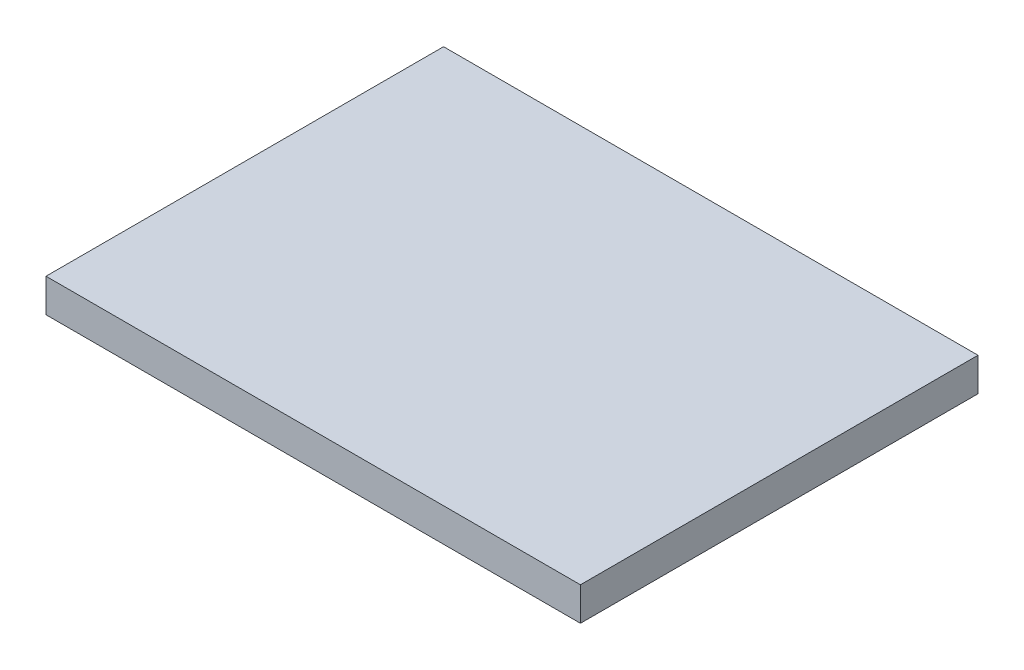
ISO-10303-21;
HEADER;
FILE_DESCRIPTION(('STEP AP214'),'2;1');
FILE_NAME('part.step','',(''),(''),'','','');
FILE_SCHEMA(('AUTOMOTIVE_DESIGN { 1 0 10303 214 1 1 1 1 }'));
ENDSEC;
DATA;
#1=APPLICATION_CONTEXT('core data for automotive mechanical design processes');
#2=APPLICATION_PROTOCOL_DEFINITION('international standard','automotive_design',2000,#1);
#3=PRODUCT_CONTEXT('',#1,'mechanical');
#4=PRODUCT('Part','Part','',(#3));
#5=PRODUCT_RELATED_PRODUCT_CATEGORY('part','',(#4));
#6=PRODUCT_DEFINITION_FORMATION('','',#4);
#7=PRODUCT_DEFINITION_CONTEXT('part definition',#1,'design');
#8=PRODUCT_DEFINITION('design','',#6,#7);
#9=PRODUCT_DEFINITION_SHAPE('','',#8);
#10=(LENGTH_UNIT() NAMED_UNIT(*) SI_UNIT(.MILLI.,.METRE.));
#11=(NAMED_UNIT(*) PLANE_ANGLE_UNIT() SI_UNIT($,.RADIAN.));
#12=(NAMED_UNIT(*) SI_UNIT($,.STERADIAN.) SOLID_ANGLE_UNIT());
#13=UNCERTAINTY_MEASURE_WITH_UNIT(LENGTH_MEASURE(1.E-05),#10,'distance_accuracy_value','');
#14=(GEOMETRIC_REPRESENTATION_CONTEXT(3) GLOBAL_UNCERTAINTY_ASSIGNED_CONTEXT((#13)) GLOBAL_UNIT_ASSIGNED_CONTEXT((#10,
#11,#12)) REPRESENTATION_CONTEXT('',''));
#15=CARTESIAN_POINT('',(0.,0.,0.));
#16=DIRECTION('',(0.,0.,1.));
#17=DIRECTION('',(1.,0.,0.));
#18=AXIS2_PLACEMENT_3D('',#15,#16,#17);
#19=CARTESIAN_POINT('',(0.,6.35,0.));
#20=DIRECTION('',(1.,0.,0.));
#21=DIRECTION('',(0.,0.,-1.));
#22=AXIS2_PLACEMENT_3D('',#19,#20,#21);
#23=PLANE('',#22);
#24=DIRECTION('',(0.,0.,1.));
#25=VECTOR('',#24,1.);
#26=CARTESIAN_POINT('',(0.,0.,0.));
#27=LINE('',#26,#25);
#28=CARTESIAN_POINT('',(0.,0.,-75.6470543184821));
#29=VERTEX_POINT('',#28);
#30=CARTESIAN_POINT('',(0.,0.,0.));
#31=VERTEX_POINT('',#30);
#32=EDGE_CURVE('E100',#29,#31,#27,.T.);
#33=ORIENTED_EDGE('',*,*,#32,.T.);
#34=DIRECTION('',(0.,-1.,0.));
#35=VECTOR('',#34,1.);
#36=CARTESIAN_POINT('',(0.,6.35,0.));
#37=LINE('',#36,#35);
#38=CARTESIAN_POINT('',(0.,6.35,0.));
#39=VERTEX_POINT('',#38);
#40=EDGE_CURVE('E11',#39,#31,#37,.T.);
#41=ORIENTED_EDGE('',*,*,#40,.F.);
#42=DIRECTION('',(0.,0.,1.));
#43=VECTOR('',#42,1.);
#44=CARTESIAN_POINT('',(0.,6.35,0.));
#45=LINE('',#44,#43);
#46=CARTESIAN_POINT('',(0.,6.35,-75.6470543184821));
#47=VERTEX_POINT('',#46);
#48=EDGE_CURVE('E88',#47,#39,#45,.T.);
#49=ORIENTED_EDGE('',*,*,#48,.F.);
#50=DIRECTION('',(0.,-1.,0.));
#51=VECTOR('',#50,1.);
#52=CARTESIAN_POINT('',(0.,6.35,-75.6470543184821));
#53=LINE('',#52,#51);
#54=EDGE_CURVE('E96',#47,#29,#53,.T.);
#55=ORIENTED_EDGE('',*,*,#54,.T.);
#56=EDGE_LOOP('',(#33,#41,#49,#55));
#57=FACE_BOUND('',#56,.T.);
#58=ADVANCED_FACE('F37',(#57),#23,.F.);
#59=CARTESIAN_POINT('',(0.,6.35,0.));
#60=DIRECTION('',(0.,0.,-1.));
#61=DIRECTION('',(-1.,0.,0.));
#62=AXIS2_PLACEMENT_3D('',#59,#60,#61);
#63=PLANE('',#62);
#64=DIRECTION('',(1.,0.,0.));
#65=VECTOR('',#64,1.);
#66=CARTESIAN_POINT('',(0.,0.,0.));
#67=LINE('',#66,#65);
#68=CARTESIAN_POINT('',(101.689482854353,0.,0.));
#69=VERTEX_POINT('',#68);
#70=EDGE_CURVE('E92',#31,#69,#67,.T.);
#71=ORIENTED_EDGE('',*,*,#70,.T.);
#72=DIRECTION('',(0.,-1.,0.));
#73=VECTOR('',#72,1.);
#74=CARTESIAN_POINT('',(101.689482854353,6.35,0.));
#75=LINE('',#74,#73);
#76=CARTESIAN_POINT('',(101.689482854353,6.35,0.));
#77=VERTEX_POINT('',#76);
#78=EDGE_CURVE('E45',#77,#69,#75,.T.);
#79=ORIENTED_EDGE('',*,*,#78,.F.);
#80=DIRECTION('',(1.,0.,0.));
#81=VECTOR('',#80,1.);
#82=CARTESIAN_POINT('',(0.,6.35,0.));
#83=LINE('',#82,#81);
#84=EDGE_CURVE('E83',#39,#77,#83,.T.);
#85=ORIENTED_EDGE('',*,*,#84,.F.);
#86=ORIENTED_EDGE('',*,*,#40,.T.);
#87=EDGE_LOOP('',(#71,#79,#85,#86));
#88=FACE_BOUND('',#87,.T.);
#89=ADVANCED_FACE('F91',(#88),#63,.F.);
#90=CARTESIAN_POINT('',(101.689482854353,6.35,0.));
#91=DIRECTION('',(-1.,0.,0.));
#92=DIRECTION('',(0.,0.,1.));
#93=AXIS2_PLACEMENT_3D('',#90,#91,#92);
#94=PLANE('',#93);
#95=DIRECTION('',(0.,0.,-1.));
#96=VECTOR('',#95,1.);
#97=CARTESIAN_POINT('',(101.689482854353,0.,0.));
#98=LINE('',#97,#96);
#99=CARTESIAN_POINT('',(101.689482854353,0.,-75.6470543184821));
#100=VERTEX_POINT('',#99);
#101=EDGE_CURVE('E70',#69,#100,#98,.T.);
#102=ORIENTED_EDGE('',*,*,#101,.T.);
#103=DIRECTION('',(0.,-1.,0.));
#104=VECTOR('',#103,1.);
#105=CARTESIAN_POINT('',(101.689482854353,6.35,-75.6470543184821));
#106=LINE('',#105,#104);
#107=CARTESIAN_POINT('',(101.689482854353,6.35,-75.6470543184821));
#108=VERTEX_POINT('',#107);
#109=EDGE_CURVE('E93',#108,#100,#106,.T.);
#110=ORIENTED_EDGE('',*,*,#109,.F.);
#111=DIRECTION('',(0.,0.,-1.));
#112=VECTOR('',#111,1.);
#113=CARTESIAN_POINT('',(101.689482854353,6.35,0.));
#114=LINE('',#113,#112);
#115=EDGE_CURVE('E86',#77,#108,#114,.T.);
#116=ORIENTED_EDGE('',*,*,#115,.F.);
#117=ORIENTED_EDGE('',*,*,#78,.T.);
#118=EDGE_LOOP('',(#102,#110,#116,#117));
#119=FACE_BOUND('',#118,.T.);
#120=ADVANCED_FACE('F94',(#119),#94,.F.);
#121=CARTESIAN_POINT('',(0.,6.35,-75.6470543184821));
#122=DIRECTION('',(0.,0.,1.));
#123=DIRECTION('',(1.,0.,0.));
#124=AXIS2_PLACEMENT_3D('',#121,#122,#123);
#125=PLANE('',#124);
#126=DIRECTION('',(-1.,0.,0.));
#127=VECTOR('',#126,1.);
#128=CARTESIAN_POINT('',(0.,0.,-75.6470543184821));
#129=LINE('',#128,#127);
#130=EDGE_CURVE('E76',#100,#29,#129,.T.);
#131=ORIENTED_EDGE('',*,*,#130,.T.);
#132=ORIENTED_EDGE('',*,*,#54,.F.);
#133=DIRECTION('',(-1.,0.,0.));
#134=VECTOR('',#133,1.);
#135=CARTESIAN_POINT('',(0.,6.35,-75.6470543184821));
#136=LINE('',#135,#134);
#137=EDGE_CURVE('E53',#108,#47,#136,.T.);
#138=ORIENTED_EDGE('',*,*,#137,.F.);
#139=ORIENTED_EDGE('',*,*,#109,.T.);
#140=EDGE_LOOP('',(#131,#132,#138,#139));
#141=FACE_BOUND('',#140,.T.);
#142=ADVANCED_FACE('F107',(#141),#125,.F.);
#143=CARTESIAN_POINT('',(0.,6.35,0.));
#144=DIRECTION('',(0.,-1.,0.));
#145=DIRECTION('',(0.,0.,-1.));
#146=AXIS2_PLACEMENT_3D('',#143,#144,#145);
#147=PLANE('',#146);
#148=ORIENTED_EDGE('',*,*,#48,.T.);
#149=ORIENTED_EDGE('',*,*,#84,.T.);
#150=ORIENTED_EDGE('',*,*,#115,.T.);
#151=ORIENTED_EDGE('',*,*,#137,.T.);
#152=EDGE_LOOP('',(#148,#149,#150,#151));
#153=FACE_BOUND('',#152,.T.);
#154=ADVANCED_FACE('F84',(#153),#147,.F.);
#155=CARTESIAN_POINT('',(0.,0.,0.));
#156=DIRECTION('',(0.,-1.,0.));
#157=DIRECTION('',(0.,0.,-1.));
#158=AXIS2_PLACEMENT_3D('',#155,#156,#157);
#159=PLANE('',#158);
#160=ORIENTED_EDGE('',*,*,#32,.F.);
#161=ORIENTED_EDGE('',*,*,#130,.F.);
#162=ORIENTED_EDGE('',*,*,#101,.F.);
#163=ORIENTED_EDGE('',*,*,#70,.F.);
#164=EDGE_LOOP('',(#160,#161,#162,#163));
#165=FACE_BOUND('',#164,.T.);
#166=ADVANCED_FACE('F110',(#165),#159,.T.);
#167=CLOSED_SHELL('',(#58,#89,#120,#142,#154,#166));
#168=MANIFOLD_SOLID_BREP('B2',#167);
#169=ADVANCED_BREP_SHAPE_REPRESENTATION('',(#18,#168),#14);
#170=SHAPE_DEFINITION_REPRESENTATION(#9,#169);
ENDSEC;
END-ISO-10303-21;
